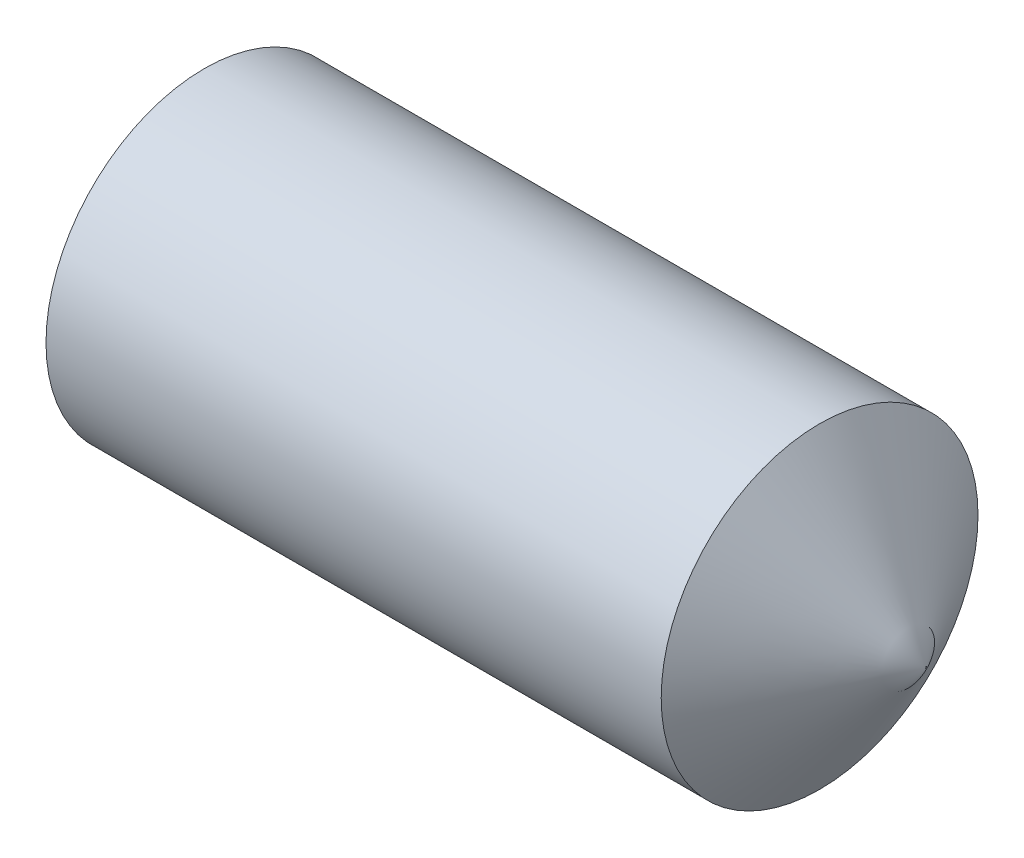
ISO-10303-21;
HEADER;
FILE_DESCRIPTION(('STEP AP214'),'2;1');
FILE_NAME('part.step','',(''),(''),'','','');
FILE_SCHEMA(('AUTOMOTIVE_DESIGN { 1 0 10303 214 1 1 1 1 }'));
ENDSEC;
DATA;
#1=APPLICATION_CONTEXT('core data for automotive mechanical design processes');
#2=APPLICATION_PROTOCOL_DEFINITION('international standard','automotive_design',2000,#1);
#3=PRODUCT_CONTEXT('',#1,'mechanical');
#4=PRODUCT('Part','Part','',(#3));
#5=PRODUCT_RELATED_PRODUCT_CATEGORY('part','',(#4));
#6=PRODUCT_DEFINITION_FORMATION('','',#4);
#7=PRODUCT_DEFINITION_CONTEXT('part definition',#1,'design');
#8=PRODUCT_DEFINITION('design','',#6,#7);
#9=PRODUCT_DEFINITION_SHAPE('','',#8);
#10=(LENGTH_UNIT() NAMED_UNIT(*) SI_UNIT(.MILLI.,.METRE.));
#11=(NAMED_UNIT(*) PLANE_ANGLE_UNIT() SI_UNIT($,.RADIAN.));
#12=(NAMED_UNIT(*) SI_UNIT($,.STERADIAN.) SOLID_ANGLE_UNIT());
#13=UNCERTAINTY_MEASURE_WITH_UNIT(LENGTH_MEASURE(1.E-05),#10,'distance_accuracy_value','');
#14=(GEOMETRIC_REPRESENTATION_CONTEXT(3) GLOBAL_UNCERTAINTY_ASSIGNED_CONTEXT((#13)) GLOBAL_UNIT_ASSIGNED_CONTEXT((#10,
#11,#12)) REPRESENTATION_CONTEXT('',''));
#15=CARTESIAN_POINT('',(0.,0.,0.));
#16=DIRECTION('',(0.,0.,1.));
#17=DIRECTION('',(1.,0.,0.));
#18=AXIS2_PLACEMENT_3D('',#15,#16,#17);
#19=CARTESIAN_POINT('',(95.7627063848835,0.,0.));
#20=DIRECTION('',(-1.,0.,0.));
#21=DIRECTION('',(0.,0.,1.));
#22=AXIS2_PLACEMENT_3D('',#19,#20,#21);
#23=CONICAL_SURFACE('',#22,0.,0.979821963793501);
#24=CARTESIAN_POINT('',(81.6560187587818,0.,0.));
#25=DIRECTION('',(-1.,0.,0.));
#26=DIRECTION('',(0.,0.,1.));
#27=AXIS2_PLACEMENT_3D('',#24,#25,#26);
#28=CIRCLE('',#27,21.0243902119787);
#29=CARTESIAN_POINT('',(81.6560187587818,0.,21.0243902119787));
#30=VERTEX_POINT('',#29);
#31=EDGE_CURVE('E11',#30,#30,#28,.T.);
#32=ORIENTED_EDGE('',*,*,#31,.F.);
#33=EDGE_LOOP('',(#32));
#34=FACE_BOUND('',#33,.T.);
#35=CARTESIAN_POINT('',(95.7627063848835,0.,0.));
#36=VERTEX_POINT('',#35);
#37=VERTEX_LOOP('',#36);
#38=FACE_BOUND('',#37,.T.);
#39=ADVANCED_FACE('F39',(#34,#38),#23,.T.);
#40=CARTESIAN_POINT('',(0.,0.,0.));
#41=DIRECTION('',(-1.,0.,0.));
#42=DIRECTION('',(0.,0.,1.));
#43=AXIS2_PLACEMENT_3D('',#40,#41,#42);
#44=CYLINDRICAL_SURFACE('',#43,21.0243902119787);
#45=CARTESIAN_POINT('',(0.,0.,0.));
#46=DIRECTION('',(-1.,0.,0.));
#47=DIRECTION('',(0.,0.,1.));
#48=AXIS2_PLACEMENT_3D('',#45,#46,#47);
#49=CIRCLE('',#48,21.0243902119787);
#50=CARTESIAN_POINT('',(0.,0.,21.0243902119787));
#51=VERTEX_POINT('',#50);
#52=EDGE_CURVE('E46',#51,#51,#49,.T.);
#53=ORIENTED_EDGE('',*,*,#52,.F.);
#54=EDGE_LOOP('',(#53));
#55=FACE_BOUND('',#54,.T.);
#56=ORIENTED_EDGE('',*,*,#31,.T.);
#57=EDGE_LOOP('',(#56));
#58=FACE_BOUND('',#57,.T.);
#59=ADVANCED_FACE('F50',(#55,#58),#44,.T.);
#60=CARTESIAN_POINT('',(0.,0.,0.));
#61=DIRECTION('',(1.,0.,0.));
#62=DIRECTION('',(0.,0.,-1.));
#63=AXIS2_PLACEMENT_3D('',#60,#61,#62);
#64=PLANE('',#63);
#65=ORIENTED_EDGE('',*,*,#52,.T.);
#66=EDGE_LOOP('',(#65));
#67=FACE_BOUND('',#66,.T.);
#68=ADVANCED_FACE('F55',(#67),#64,.F.);
#69=CLOSED_SHELL('',(#39,#59,#68));
#70=MANIFOLD_SOLID_BREP('B2',#69);
#71=ADVANCED_BREP_SHAPE_REPRESENTATION('',(#18,#70),#14);
#72=SHAPE_DEFINITION_REPRESENTATION(#9,#71);
ENDSEC;
END-ISO-10303-21;
